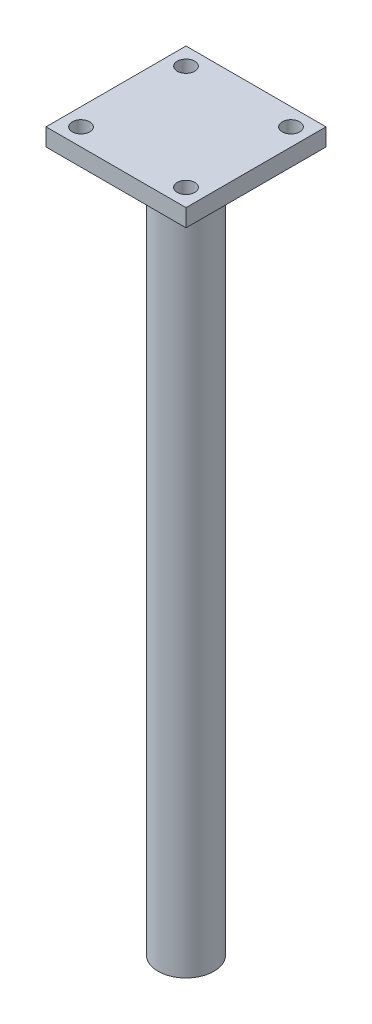
ISO-10303-21;
HEADER;
FILE_DESCRIPTION(('STEP AP214'),'2;1');
FILE_NAME('part.step','',(''),(''),'','','');
FILE_SCHEMA(('AUTOMOTIVE_DESIGN { 1 0 10303 214 1 1 1 1 }'));
ENDSEC;
DATA;
#1=APPLICATION_CONTEXT('core data for automotive mechanical design processes');
#2=APPLICATION_PROTOCOL_DEFINITION('international standard','automotive_design',2000,#1);
#3=PRODUCT_CONTEXT('',#1,'mechanical');
#4=PRODUCT('Part','Part','',(#3));
#5=PRODUCT_RELATED_PRODUCT_CATEGORY('part','',(#4));
#6=PRODUCT_DEFINITION_FORMATION('','',#4);
#7=PRODUCT_DEFINITION_CONTEXT('part definition',#1,'design');
#8=PRODUCT_DEFINITION('design','',#6,#7);
#9=PRODUCT_DEFINITION_SHAPE('','',#8);
#10=(LENGTH_UNIT() NAMED_UNIT(*) SI_UNIT(.MILLI.,.METRE.));
#11=(NAMED_UNIT(*) PLANE_ANGLE_UNIT() SI_UNIT($,.RADIAN.));
#12=(NAMED_UNIT(*) SI_UNIT($,.STERADIAN.) SOLID_ANGLE_UNIT());
#13=UNCERTAINTY_MEASURE_WITH_UNIT(LENGTH_MEASURE(1.E-05),#10,'distance_accuracy_value','');
#14=(GEOMETRIC_REPRESENTATION_CONTEXT(3) GLOBAL_UNCERTAINTY_ASSIGNED_CONTEXT((#13)) GLOBAL_UNIT_ASSIGNED_CONTEXT((#10,
#11,#12)) REPRESENTATION_CONTEXT('',''));
#15=CARTESIAN_POINT('',(0.,0.,0.));
#16=DIRECTION('',(0.,0.,1.));
#17=DIRECTION('',(1.,0.,0.));
#18=AXIS2_PLACEMENT_3D('',#15,#16,#17);
#19=CARTESIAN_POINT('',(0.,200.,0.));
#20=DIRECTION('',(0.,-1.,0.));
#21=DIRECTION('',(0.,0.,-1.));
#22=AXIS2_PLACEMENT_3D('',#19,#20,#21);
#23=CYLINDRICAL_SURFACE('',#22,8.);
#24=CARTESIAN_POINT('',(0.,200.,0.));
#25=DIRECTION('',(0.,1.,0.));
#26=DIRECTION('',(0.,0.,1.));
#27=AXIS2_PLACEMENT_3D('',#24,#25,#26);
#28=CIRCLE('',#27,8.);
#29=CARTESIAN_POINT('',(0.,200.,8.));
#30=VERTEX_POINT('',#29);
#31=EDGE_CURVE('E11',#30,#30,#28,.T.);
#32=ORIENTED_EDGE('',*,*,#31,.F.);
#33=EDGE_LOOP('',(#32));
#34=FACE_BOUND('',#33,.T.);
#35=CARTESIAN_POINT('',(0.,0.,0.));
#36=DIRECTION('',(0.,1.,0.));
#37=DIRECTION('',(0.,0.,1.));
#38=AXIS2_PLACEMENT_3D('',#35,#36,#37);
#39=CIRCLE('',#38,8.);
#40=CARTESIAN_POINT('',(0.,0.,8.));
#41=VERTEX_POINT('',#40);
#42=EDGE_CURVE('E37',#41,#41,#39,.T.);
#43=ORIENTED_EDGE('',*,*,#42,.T.);
#44=EDGE_LOOP('',(#43));
#45=FACE_BOUND('',#44,.T.);
#46=ADVANCED_FACE('F34',(#34,#45),#23,.T.);
#47=CARTESIAN_POINT('',(0.,0.,0.));
#48=DIRECTION('',(0.,1.,0.));
#49=DIRECTION('',(0.,0.,1.));
#50=AXIS2_PLACEMENT_3D('',#47,#48,#49);
#51=PLANE('',#50);
#52=ORIENTED_EDGE('',*,*,#42,.F.);
#53=EDGE_LOOP('',(#52));
#54=FACE_BOUND('',#53,.T.);
#55=ADVANCED_FACE('F114',(#54),#51,.F.);
#56=CARTESIAN_POINT('',(20.,205.,20.));
#57=DIRECTION('',(-1.,0.,0.));
#58=DIRECTION('',(0.,0.,1.));
#59=AXIS2_PLACEMENT_3D('',#56,#57,#58);
#60=PLANE('',#59);
#61=DIRECTION('',(0.,0.,-1.));
#62=VECTOR('',#61,1.);
#63=CARTESIAN_POINT('',(20.,200.,20.));
#64=LINE('',#63,#62);
#65=CARTESIAN_POINT('',(20.,200.,20.));
#66=VERTEX_POINT('',#65);
#67=CARTESIAN_POINT('',(20.,200.,-20.));
#68=VERTEX_POINT('',#67);
#69=EDGE_CURVE('E101',#66,#68,#64,.T.);
#70=ORIENTED_EDGE('',*,*,#69,.T.);
#71=DIRECTION('',(0.,-1.,0.));
#72=VECTOR('',#71,1.);
#73=CARTESIAN_POINT('',(20.,205.,-20.));
#74=LINE('',#73,#72);
#75=CARTESIAN_POINT('',(20.,205.,-20.));
#76=VERTEX_POINT('',#75);
#77=EDGE_CURVE('E92',#76,#68,#74,.T.);
#78=ORIENTED_EDGE('',*,*,#77,.F.);
#79=DIRECTION('',(0.,0.,-1.));
#80=VECTOR('',#79,1.);
#81=CARTESIAN_POINT('',(20.,205.,20.));
#82=LINE('',#81,#80);
#83=CARTESIAN_POINT('',(20.,205.,20.));
#84=VERTEX_POINT('',#83);
#85=EDGE_CURVE('E86',#84,#76,#82,.T.);
#86=ORIENTED_EDGE('',*,*,#85,.F.);
#87=DIRECTION('',(0.,-1.,0.));
#88=VECTOR('',#87,1.);
#89=CARTESIAN_POINT('',(20.,205.,20.));
#90=LINE('',#89,#88);
#91=EDGE_CURVE('E97',#84,#66,#90,.T.);
#92=ORIENTED_EDGE('',*,*,#91,.T.);
#93=EDGE_LOOP('',(#70,#78,#86,#92));
#94=FACE_BOUND('',#93,.T.);
#95=ADVANCED_FACE('F116',(#94),#60,.F.);
#96=CARTESIAN_POINT('',(-20.,205.,-20.));
#97=DIRECTION('',(0.,0.,1.));
#98=DIRECTION('',(1.,0.,0.));
#99=AXIS2_PLACEMENT_3D('',#96,#97,#98);
#100=PLANE('',#99);
#101=DIRECTION('',(-1.,0.,0.));
#102=VECTOR('',#101,1.);
#103=CARTESIAN_POINT('',(-20.,200.,-20.));
#104=LINE('',#103,#102);
#105=CARTESIAN_POINT('',(-20.,200.,-20.));
#106=VERTEX_POINT('',#105);
#107=EDGE_CURVE('E91',#68,#106,#104,.T.);
#108=ORIENTED_EDGE('',*,*,#107,.T.);
#109=DIRECTION('',(0.,-1.,0.));
#110=VECTOR('',#109,1.);
#111=CARTESIAN_POINT('',(-20.,205.,-20.));
#112=LINE('',#111,#110);
#113=CARTESIAN_POINT('',(-20.,205.,-20.));
#114=VERTEX_POINT('',#113);
#115=EDGE_CURVE('E89',#114,#106,#112,.T.);
#116=ORIENTED_EDGE('',*,*,#115,.F.);
#117=DIRECTION('',(-1.,0.,0.));
#118=VECTOR('',#117,1.);
#119=CARTESIAN_POINT('',(-20.,205.,-20.));
#120=LINE('',#119,#118);
#121=EDGE_CURVE('E81',#76,#114,#120,.T.);
#122=ORIENTED_EDGE('',*,*,#121,.F.);
#123=ORIENTED_EDGE('',*,*,#77,.T.);
#124=EDGE_LOOP('',(#108,#116,#122,#123));
#125=FACE_BOUND('',#124,.T.);
#126=ADVANCED_FACE('F90',(#125),#100,.F.);
#127=CARTESIAN_POINT('',(-20.,205.,20.));
#128=DIRECTION('',(1.,0.,0.));
#129=DIRECTION('',(0.,0.,-1.));
#130=AXIS2_PLACEMENT_3D('',#127,#128,#129);
#131=PLANE('',#130);
#132=DIRECTION('',(0.,0.,1.));
#133=VECTOR('',#132,1.);
#134=CARTESIAN_POINT('',(-20.,200.,20.));
#135=LINE('',#134,#133);
#136=CARTESIAN_POINT('',(-20.,200.,20.));
#137=VERTEX_POINT('',#136);
#138=EDGE_CURVE('E67',#106,#137,#135,.T.);
#139=ORIENTED_EDGE('',*,*,#138,.T.);
#140=DIRECTION('',(0.,-1.,0.));
#141=VECTOR('',#140,1.);
#142=CARTESIAN_POINT('',(-20.,205.,20.));
#143=LINE('',#142,#141);
#144=CARTESIAN_POINT('',(-20.,205.,20.));
#145=VERTEX_POINT('',#144);
#146=EDGE_CURVE('E93',#145,#137,#143,.T.);
#147=ORIENTED_EDGE('',*,*,#146,.F.);
#148=DIRECTION('',(0.,0.,1.));
#149=VECTOR('',#148,1.);
#150=CARTESIAN_POINT('',(-20.,205.,20.));
#151=LINE('',#150,#149);
#152=EDGE_CURVE('E84',#114,#145,#151,.T.);
#153=ORIENTED_EDGE('',*,*,#152,.F.);
#154=ORIENTED_EDGE('',*,*,#115,.T.);
#155=EDGE_LOOP('',(#139,#147,#153,#154));
#156=FACE_BOUND('',#155,.T.);
#157=ADVANCED_FACE('F95',(#156),#131,.F.);
#158=CARTESIAN_POINT('',(-20.,205.,20.));
#159=DIRECTION('',(0.,0.,-1.));
#160=DIRECTION('',(-1.,0.,0.));
#161=AXIS2_PLACEMENT_3D('',#158,#159,#160);
#162=PLANE('',#161);
#163=DIRECTION('',(1.,0.,0.));
#164=VECTOR('',#163,1.);
#165=CARTESIAN_POINT('',(-20.,200.,20.));
#166=LINE('',#165,#164);
#167=EDGE_CURVE('E73',#137,#66,#166,.T.);
#168=ORIENTED_EDGE('',*,*,#167,.T.);
#169=ORIENTED_EDGE('',*,*,#91,.F.);
#170=DIRECTION('',(1.,0.,0.));
#171=VECTOR('',#170,1.);
#172=CARTESIAN_POINT('',(-20.,205.,20.));
#173=LINE('',#172,#171);
#174=EDGE_CURVE('E50',#145,#84,#173,.T.);
#175=ORIENTED_EDGE('',*,*,#174,.F.);
#176=ORIENTED_EDGE('',*,*,#146,.T.);
#177=EDGE_LOOP('',(#168,#169,#175,#176));
#178=FACE_BOUND('',#177,.T.);
#179=ADVANCED_FACE('F129',(#178),#162,.F.);
#180=CARTESIAN_POINT('',(0.,205.,0.));
#181=DIRECTION('',(0.,-1.,0.));
#182=DIRECTION('',(0.,0.,-1.));
#183=AXIS2_PLACEMENT_3D('',#180,#181,#182);
#184=PLANE('',#183);
#185=CARTESIAN_POINT('',(-15.,205.,15.));
#186=DIRECTION('',(0.,1.,0.));
#187=DIRECTION('',(0.,0.,1.));
#188=AXIS2_PLACEMENT_3D('',#185,#186,#187);
#189=CIRCLE('',#188,2.5);
#190=CARTESIAN_POINT('',(-15.,205.,17.5));
#191=VERTEX_POINT('',#190);
#192=EDGE_CURVE('E177',#191,#191,#189,.T.);
#193=ORIENTED_EDGE('',*,*,#192,.F.);
#194=EDGE_LOOP('',(#193));
#195=FACE_BOUND('',#194,.T.);
#196=CARTESIAN_POINT('',(15.,205.,15.));
#197=DIRECTION('',(0.,1.,0.));
#198=DIRECTION('',(0.,0.,1.));
#199=AXIS2_PLACEMENT_3D('',#196,#197,#198);
#200=CIRCLE('',#199,2.5);
#201=CARTESIAN_POINT('',(15.,205.,17.5));
#202=VERTEX_POINT('',#201);
#203=EDGE_CURVE('E169',#202,#202,#200,.T.);
#204=ORIENTED_EDGE('',*,*,#203,.F.);
#205=EDGE_LOOP('',(#204));
#206=FACE_BOUND('',#205,.T.);
#207=CARTESIAN_POINT('',(15.,205.,-15.));
#208=DIRECTION('',(0.,1.,0.));
#209=DIRECTION('',(0.,0.,1.));
#210=AXIS2_PLACEMENT_3D('',#207,#208,#209);
#211=CIRCLE('',#210,2.5);
#212=CARTESIAN_POINT('',(15.,205.,-12.5));
#213=VERTEX_POINT('',#212);
#214=EDGE_CURVE('E162',#213,#213,#211,.T.);
#215=ORIENTED_EDGE('',*,*,#214,.F.);
#216=EDGE_LOOP('',(#215));
#217=FACE_BOUND('',#216,.T.);
#218=CARTESIAN_POINT('',(-15.,205.,-15.));
#219=DIRECTION('',(0.,1.,0.));
#220=DIRECTION('',(0.,0.,1.));
#221=AXIS2_PLACEMENT_3D('',#218,#219,#220);
#222=CIRCLE('',#221,2.5);
#223=CARTESIAN_POINT('',(-15.,205.,-12.5));
#224=VERTEX_POINT('',#223);
#225=EDGE_CURVE('E166',#224,#224,#222,.T.);
#226=ORIENTED_EDGE('',*,*,#225,.F.);
#227=EDGE_LOOP('',(#226));
#228=FACE_BOUND('',#227,.T.);
#229=ORIENTED_EDGE('',*,*,#85,.T.);
#230=ORIENTED_EDGE('',*,*,#121,.T.);
#231=ORIENTED_EDGE('',*,*,#152,.T.);
#232=ORIENTED_EDGE('',*,*,#174,.T.);
#233=EDGE_LOOP('',(#229,#230,#231,#232));
#234=FACE_BOUND('',#233,.T.);
#235=ADVANCED_FACE('F82',(#195,#206,#217,#228,#234),#184,.F.);
#236=CARTESIAN_POINT('',(0.,200.,0.));
#237=DIRECTION('',(0.,-1.,0.));
#238=DIRECTION('',(0.,0.,-1.));
#239=AXIS2_PLACEMENT_3D('',#236,#237,#238);
#240=PLANE('',#239);
#241=CARTESIAN_POINT('',(-15.,200.,15.));
#242=DIRECTION('',(0.,1.,0.));
#243=DIRECTION('',(0.,0.,1.));
#244=AXIS2_PLACEMENT_3D('',#241,#242,#243);
#245=CIRCLE('',#244,2.5);
#246=CARTESIAN_POINT('',(-15.,200.,17.5));
#247=VERTEX_POINT('',#246);
#248=EDGE_CURVE('E174',#247,#247,#245,.T.);
#249=ORIENTED_EDGE('',*,*,#248,.T.);
#250=EDGE_LOOP('',(#249));
#251=FACE_BOUND('',#250,.T.);
#252=CARTESIAN_POINT('',(15.,200.,15.));
#253=DIRECTION('',(0.,1.,0.));
#254=DIRECTION('',(0.,0.,1.));
#255=AXIS2_PLACEMENT_3D('',#252,#253,#254);
#256=CIRCLE('',#255,2.5);
#257=CARTESIAN_POINT('',(15.,200.,17.5));
#258=VERTEX_POINT('',#257);
#259=EDGE_CURVE('E164',#258,#258,#256,.T.);
#260=ORIENTED_EDGE('',*,*,#259,.T.);
#261=EDGE_LOOP('',(#260));
#262=FACE_BOUND('',#261,.T.);
#263=CARTESIAN_POINT('',(15.,200.,-15.));
#264=DIRECTION('',(0.,1.,0.));
#265=DIRECTION('',(0.,0.,1.));
#266=AXIS2_PLACEMENT_3D('',#263,#264,#265);
#267=CIRCLE('',#266,2.5);
#268=CARTESIAN_POINT('',(15.,200.,-12.5));
#269=VERTEX_POINT('',#268);
#270=EDGE_CURVE('E159',#269,#269,#267,.T.);
#271=ORIENTED_EDGE('',*,*,#270,.T.);
#272=EDGE_LOOP('',(#271));
#273=FACE_BOUND('',#272,.T.);
#274=CARTESIAN_POINT('',(-15.,200.,-15.));
#275=DIRECTION('',(0.,1.,0.));
#276=DIRECTION('',(0.,0.,1.));
#277=AXIS2_PLACEMENT_3D('',#274,#275,#276);
#278=CIRCLE('',#277,2.5);
#279=CARTESIAN_POINT('',(-15.,200.,-12.5));
#280=VERTEX_POINT('',#279);
#281=EDGE_CURVE('E104',#280,#280,#278,.T.);
#282=ORIENTED_EDGE('',*,*,#281,.T.);
#283=EDGE_LOOP('',(#282));
#284=FACE_BOUND('',#283,.T.);
#285=ORIENTED_EDGE('',*,*,#31,.T.);
#286=EDGE_LOOP('',(#285));
#287=FACE_BOUND('',#286,.T.);
#288=ORIENTED_EDGE('',*,*,#69,.F.);
#289=ORIENTED_EDGE('',*,*,#167,.F.);
#290=ORIENTED_EDGE('',*,*,#138,.F.);
#291=ORIENTED_EDGE('',*,*,#107,.F.);
#292=EDGE_LOOP('',(#288,#289,#290,#291));
#293=FACE_BOUND('',#292,.T.);
#294=ADVANCED_FACE('F132',(#251,#262,#273,#284,#287,#293),#240,.T.);
#295=CARTESIAN_POINT('',(-15.,200.,-15.));
#296=DIRECTION('',(0.,1.,0.));
#297=DIRECTION('',(0.,0.,1.));
#298=AXIS2_PLACEMENT_3D('',#295,#296,#297);
#299=CYLINDRICAL_SURFACE('',#298,2.5);
#300=ORIENTED_EDGE('',*,*,#281,.F.);
#301=EDGE_LOOP('',(#300));
#302=FACE_BOUND('',#301,.T.);
#303=ORIENTED_EDGE('',*,*,#225,.T.);
#304=EDGE_LOOP('',(#303));
#305=FACE_BOUND('',#304,.T.);
#306=ADVANCED_FACE('F135',(#302,#305),#299,.F.);
#307=CARTESIAN_POINT('',(15.,200.,-15.));
#308=DIRECTION('',(0.,1.,0.));
#309=DIRECTION('',(0.,0.,1.));
#310=AXIS2_PLACEMENT_3D('',#307,#308,#309);
#311=CYLINDRICAL_SURFACE('',#310,2.5);
#312=ORIENTED_EDGE('',*,*,#270,.F.);
#313=EDGE_LOOP('',(#312));
#314=FACE_BOUND('',#313,.T.);
#315=ORIENTED_EDGE('',*,*,#214,.T.);
#316=EDGE_LOOP('',(#315));
#317=FACE_BOUND('',#316,.T.);
#318=ADVANCED_FACE('F142',(#314,#317),#311,.F.);
#319=CARTESIAN_POINT('',(15.,200.,15.));
#320=DIRECTION('',(0.,1.,0.));
#321=DIRECTION('',(0.,0.,1.));
#322=AXIS2_PLACEMENT_3D('',#319,#320,#321);
#323=CYLINDRICAL_SURFACE('',#322,2.5);
#324=ORIENTED_EDGE('',*,*,#259,.F.);
#325=EDGE_LOOP('',(#324));
#326=FACE_BOUND('',#325,.T.);
#327=ORIENTED_EDGE('',*,*,#203,.T.);
#328=EDGE_LOOP('',(#327));
#329=FACE_BOUND('',#328,.T.);
#330=ADVANCED_FACE('F147',(#326,#329),#323,.F.);
#331=CARTESIAN_POINT('',(-15.,200.,15.));
#332=DIRECTION('',(0.,1.,0.));
#333=DIRECTION('',(0.,0.,1.));
#334=AXIS2_PLACEMENT_3D('',#331,#332,#333);
#335=CYLINDRICAL_SURFACE('',#334,2.5);
#336=ORIENTED_EDGE('',*,*,#248,.F.);
#337=EDGE_LOOP('',(#336));
#338=FACE_BOUND('',#337,.T.);
#339=ORIENTED_EDGE('',*,*,#192,.T.);
#340=EDGE_LOOP('',(#339));
#341=FACE_BOUND('',#340,.T.);
#342=ADVANCED_FACE('F144',(#338,#341),#335,.F.);
#343=CLOSED_SHELL('',(#46,#55,#95,#126,#157,#179,#235,#294,#306,#318,#330,#342));
#344=MANIFOLD_SOLID_BREP('B2',#343);
#345=ADVANCED_BREP_SHAPE_REPRESENTATION('',(#18,#344),#14);
#346=SHAPE_DEFINITION_REPRESENTATION(#9,#345);
ENDSEC;
END-ISO-10303-21;
